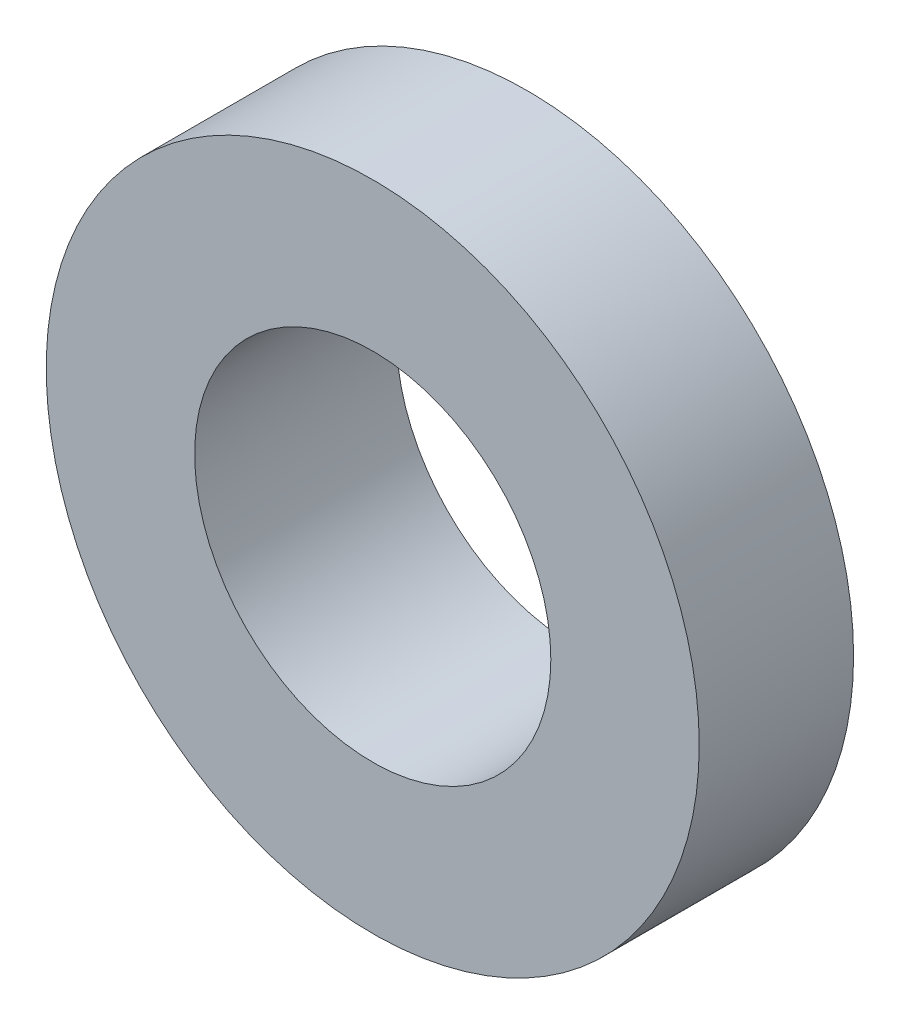
ISO-10303-21;
HEADER;
FILE_DESCRIPTION(('STEP AP214'),'2;1');
FILE_NAME('part.step','',(''),(''),'','','');
FILE_SCHEMA(('AUTOMOTIVE_DESIGN { 1 0 10303 214 1 1 1 1 }'));
ENDSEC;
DATA;
#1=APPLICATION_CONTEXT('core data for automotive mechanical design processes');
#2=APPLICATION_PROTOCOL_DEFINITION('international standard','automotive_design',2000,#1);
#3=PRODUCT_CONTEXT('',#1,'mechanical');
#4=PRODUCT('Part','Part','',(#3));
#5=PRODUCT_RELATED_PRODUCT_CATEGORY('part','',(#4));
#6=PRODUCT_DEFINITION_FORMATION('','',#4);
#7=PRODUCT_DEFINITION_CONTEXT('part definition',#1,'design');
#8=PRODUCT_DEFINITION('design','',#6,#7);
#9=PRODUCT_DEFINITION_SHAPE('','',#8);
#10=(LENGTH_UNIT() NAMED_UNIT(*) SI_UNIT(.MILLI.,.METRE.));
#11=(NAMED_UNIT(*) PLANE_ANGLE_UNIT() SI_UNIT($,.RADIAN.));
#12=(NAMED_UNIT(*) SI_UNIT($,.STERADIAN.) SOLID_ANGLE_UNIT());
#13=UNCERTAINTY_MEASURE_WITH_UNIT(LENGTH_MEASURE(1.E-05),#10,'distance_accuracy_value','');
#14=(GEOMETRIC_REPRESENTATION_CONTEXT(3) GLOBAL_UNCERTAINTY_ASSIGNED_CONTEXT((#13)) GLOBAL_UNIT_ASSIGNED_CONTEXT((#10,
#11,#12)) REPRESENTATION_CONTEXT('',''));
#15=CARTESIAN_POINT('',(0.,0.,0.));
#16=DIRECTION('',(0.,0.,1.));
#17=DIRECTION('',(1.,0.,0.));
#18=AXIS2_PLACEMENT_3D('',#15,#16,#17);
#19=CARTESIAN_POINT('',(0.,0.,150.));
#20=DIRECTION('',(0.,0.,1.));
#21=DIRECTION('',(1.,0.,0.));
#22=AXIS2_PLACEMENT_3D('',#19,#20,#21);
#23=CYLINDRICAL_SURFACE('',#22,15.);
#24=CARTESIAN_POINT('',(0.,0.,17.));
#25=DIRECTION('',(0.,0.,1.));
#26=DIRECTION('',(1.,0.,0.));
#27=AXIS2_PLACEMENT_3D('',#24,#25,#26);
#28=CIRCLE('',#27,15.);
#29=CARTESIAN_POINT('',(15.,0.,17.));
#30=VERTEX_POINT('',#29);
#31=EDGE_CURVE('E63',#30,#30,#28,.T.);
#32=ORIENTED_EDGE('',*,*,#31,.T.);
#33=EDGE_LOOP('',(#32));
#34=FACE_BOUND('',#33,.T.);
#35=CARTESIAN_POINT('',(0.,0.,0.));
#36=DIRECTION('',(0.,0.,1.));
#37=DIRECTION('',(1.,0.,0.));
#38=AXIS2_PLACEMENT_3D('',#35,#36,#37);
#39=CIRCLE('',#38,15.);
#40=CARTESIAN_POINT('',(15.,0.,0.));
#41=VERTEX_POINT('',#40);
#42=EDGE_CURVE('E10',#41,#41,#39,.T.);
#43=ORIENTED_EDGE('',*,*,#42,.F.);
#44=EDGE_LOOP('',(#43));
#45=FACE_BOUND('',#44,.T.);
#46=ADVANCED_FACE('F34',(#34,#45),#23,.F.);
#47=CARTESIAN_POINT('',(15.,0.,0.));
#48=DIRECTION('',(0.,0.,-1.));
#49=DIRECTION('',(-1.,0.,0.));
#50=AXIS2_PLACEMENT_3D('',#47,#48,#49);
#51=PLANE('',#50);
#52=ORIENTED_EDGE('',*,*,#42,.T.);
#53=EDGE_LOOP('',(#52));
#54=FACE_BOUND('',#53,.T.);
#55=CARTESIAN_POINT('',(0.,0.,0.));
#56=DIRECTION('',(0.,0.,1.));
#57=DIRECTION('',(1.,0.,0.));
#58=AXIS2_PLACEMENT_3D('',#55,#56,#57);
#59=CIRCLE('',#58,19.5);
#60=CARTESIAN_POINT('',(19.5,0.,0.));
#61=VERTEX_POINT('',#60);
#62=EDGE_CURVE('E45',#61,#61,#59,.T.);
#63=ORIENTED_EDGE('',*,*,#62,.F.);
#64=EDGE_LOOP('',(#63));
#65=FACE_BOUND('',#64,.T.);
#66=ADVANCED_FACE('F83',(#54,#65),#51,.T.);
#67=CARTESIAN_POINT('',(0.,0.,4.));
#68=DIRECTION('',(0.,0.,1.));
#69=DIRECTION('',(1.,0.,0.));
#70=AXIS2_PLACEMENT_3D('',#67,#68,#69);
#71=CONICAL_SURFACE('',#70,23.5,0.785398163397448);
#72=ORIENTED_EDGE('',*,*,#62,.T.);
#73=EDGE_LOOP('',(#72));
#74=FACE_BOUND('',#73,.T.);
#75=CARTESIAN_POINT('',(0.,0.,4.));
#76=DIRECTION('',(0.,0.,1.));
#77=DIRECTION('',(1.,0.,0.));
#78=AXIS2_PLACEMENT_3D('',#75,#76,#77);
#79=CIRCLE('',#78,23.5);
#80=CARTESIAN_POINT('',(23.5,0.,4.));
#81=VERTEX_POINT('',#80);
#82=EDGE_CURVE('E48',#81,#81,#79,.T.);
#83=ORIENTED_EDGE('',*,*,#82,.F.);
#84=EDGE_LOOP('',(#83));
#85=FACE_BOUND('',#84,.T.);
#86=ADVANCED_FACE('F89',(#74,#85),#71,.T.);
#87=CARTESIAN_POINT('',(23.5,0.,4.));
#88=DIRECTION('',(0.,0.,-1.));
#89=DIRECTION('',(-1.,0.,0.));
#90=AXIS2_PLACEMENT_3D('',#87,#88,#89);
#91=PLANE('',#90);
#92=ORIENTED_EDGE('',*,*,#82,.T.);
#93=EDGE_LOOP('',(#92));
#94=FACE_BOUND('',#93,.T.);
#95=CARTESIAN_POINT('',(0.,0.,4.));
#96=DIRECTION('',(0.,0.,1.));
#97=DIRECTION('',(1.,0.,0.));
#98=AXIS2_PLACEMENT_3D('',#95,#96,#97);
#99=CIRCLE('',#98,27.5);
#100=CARTESIAN_POINT('',(27.5,0.,4.));
#101=VERTEX_POINT('',#100);
#102=EDGE_CURVE('E53',#101,#101,#99,.T.);
#103=ORIENTED_EDGE('',*,*,#102,.F.);
#104=EDGE_LOOP('',(#103));
#105=FACE_BOUND('',#104,.T.);
#106=ADVANCED_FACE('F82',(#94,#105),#91,.T.);
#107=CARTESIAN_POINT('',(0.,0.,150.));
#108=DIRECTION('',(0.,0.,1.));
#109=DIRECTION('',(1.,0.,0.));
#110=AXIS2_PLACEMENT_3D('',#107,#108,#109);
#111=CYLINDRICAL_SURFACE('',#110,27.5);
#112=ORIENTED_EDGE('',*,*,#102,.T.);
#113=EDGE_LOOP('',(#112));
#114=FACE_BOUND('',#113,.T.);
#115=CARTESIAN_POINT('',(0.,0.,17.));
#116=DIRECTION('',(0.,0.,1.));
#117=DIRECTION('',(1.,0.,0.));
#118=AXIS2_PLACEMENT_3D('',#115,#116,#117);
#119=CIRCLE('',#118,27.5);
#120=CARTESIAN_POINT('',(27.5,0.,17.));
#121=VERTEX_POINT('',#120);
#122=EDGE_CURVE('E58',#121,#121,#119,.T.);
#123=ORIENTED_EDGE('',*,*,#122,.F.);
#124=EDGE_LOOP('',(#123));
#125=FACE_BOUND('',#124,.T.);
#126=ADVANCED_FACE('F74',(#114,#125),#111,.T.);
#127=CARTESIAN_POINT('',(27.5,0.,17.));
#128=DIRECTION('',(0.,0.,1.));
#129=DIRECTION('',(1.,0.,0.));
#130=AXIS2_PLACEMENT_3D('',#127,#128,#129);
#131=PLANE('',#130);
#132=ORIENTED_EDGE('',*,*,#122,.T.);
#133=EDGE_LOOP('',(#132));
#134=FACE_BOUND('',#133,.T.);
#135=ORIENTED_EDGE('',*,*,#31,.F.);
#136=EDGE_LOOP('',(#135));
#137=FACE_BOUND('',#136,.T.);
#138=ADVANCED_FACE('F75',(#134,#137),#131,.T.);
#139=CLOSED_SHELL('',(#46,#66,#86,#106,#126,#138));
#140=MANIFOLD_SOLID_BREP('B2',#139);
#141=ADVANCED_BREP_SHAPE_REPRESENTATION('',(#18,#140),#14);
#142=SHAPE_DEFINITION_REPRESENTATION(#9,#141);
ENDSEC;
END-ISO-10303-21;
